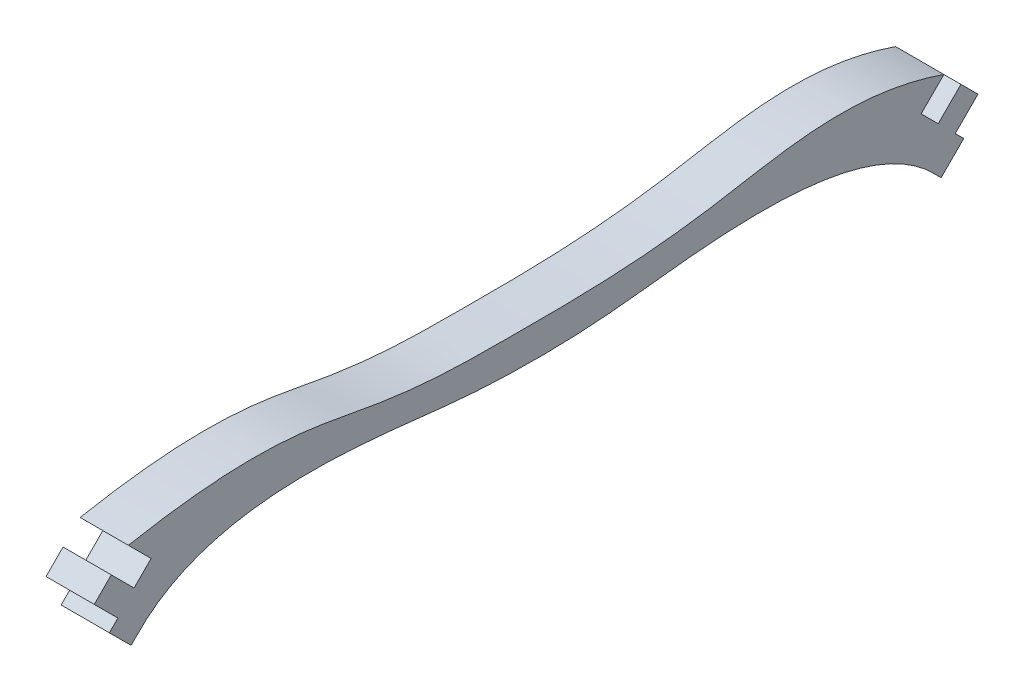
ISO-10303-21;
HEADER;
FILE_DESCRIPTION(('STEP AP214'),'2;1');
FILE_NAME('part.step','',(''),(''),'','','');
FILE_SCHEMA(('AUTOMOTIVE_DESIGN { 1 0 10303 214 1 1 1 1 }'));
ENDSEC;
DATA;
#1=APPLICATION_CONTEXT('core data for automotive mechanical design processes');
#2=APPLICATION_PROTOCOL_DEFINITION('international standard','automotive_design',2000,#1);
#3=PRODUCT_CONTEXT('',#1,'mechanical');
#4=PRODUCT('Part','Part','',(#3));
#5=PRODUCT_RELATED_PRODUCT_CATEGORY('part','',(#4));
#6=PRODUCT_DEFINITION_FORMATION('','',#4);
#7=PRODUCT_DEFINITION_CONTEXT('part definition',#1,'design');
#8=PRODUCT_DEFINITION('design','',#6,#7);
#9=PRODUCT_DEFINITION_SHAPE('','',#8);
#10=(LENGTH_UNIT() NAMED_UNIT(*) SI_UNIT(.MILLI.,.METRE.));
#11=(NAMED_UNIT(*) PLANE_ANGLE_UNIT() SI_UNIT($,.RADIAN.));
#12=(NAMED_UNIT(*) SI_UNIT($,.STERADIAN.) SOLID_ANGLE_UNIT());
#13=UNCERTAINTY_MEASURE_WITH_UNIT(LENGTH_MEASURE(1.E-05),#10,'distance_accuracy_value','');
#14=(GEOMETRIC_REPRESENTATION_CONTEXT(3) GLOBAL_UNCERTAINTY_ASSIGNED_CONTEXT((#13)) GLOBAL_UNIT_ASSIGNED_CONTEXT((#10,
#11,#12)) REPRESENTATION_CONTEXT('',''));
#15=CARTESIAN_POINT('',(0.,0.,0.));
#16=DIRECTION('',(0.,0.,1.));
#17=DIRECTION('',(1.,0.,0.));
#18=AXIS2_PLACEMENT_3D('',#15,#16,#17);
#19=CARTESIAN_POINT('',(6.,-0.70710678118655,50.7071067811865));
#20=CARTESIAN_POINT('',(6.,2.27627188658258,34.9408916969506));
#21=CARTESIAN_POINT('',(6.,-2.00631739391686,17.5880951778399));
#22=CARTESIAN_POINT('',(6.,-1.9737140086132,8.15045285990762));
#23=CARTESIAN_POINT('',(6.,-2.02794504432124,-7.03974104073929));
#24=CARTESIAN_POINT('',(6.,-1.2143781169843,-22.7757338302769));
#25=CARTESIAN_POINT('',(6.,3.25387403329058,-39.3055310529928));
#26=CARTESIAN_POINT('',(6.,-0.707106781186569,-50.7071067811866));
#27=B_SPLINE_CURVE_WITH_KNOTS('',3,(#19,#20,#21,#22,#23,#24,#25,#26),.UNSPECIFIED.,.F.,.F.,(4,1,
1,1,1,4),(0.,0.188415067306707,0.445999154863595,0.506836248432345,0.735948909425449,1.),.UNSPECIFIED.);
#28=DIRECTION('',(-1.,0.,0.));
#29=VECTOR('',#28,1.);
#30=SURFACE_OF_LINEAR_EXTRUSION('',#27,#29);
#31=CARTESIAN_POINT('',(0.,-0.70710678118655,50.7071067811865));
#32=CARTESIAN_POINT('',(0.,2.27627188658258,34.9408916969506));
#33=CARTESIAN_POINT('',(0.,-2.00631739391686,17.5880951778399));
#34=CARTESIAN_POINT('',(0.,-1.9737140086132,8.15045285990762));
#35=CARTESIAN_POINT('',(0.,-2.02794504432124,-7.03974104073929));
#36=CARTESIAN_POINT('',(0.,-1.2143781169843,-22.7757338302769));
#37=CARTESIAN_POINT('',(0.,3.25387403329058,-39.3055310529928));
#38=CARTESIAN_POINT('',(0.,-0.707106781186569,-50.7071067811866));
#39=B_SPLINE_CURVE_WITH_KNOTS('',3,(#31,#32,#33,#34,#35,#36,#37,#38),.UNSPECIFIED.,.F.,.F.,(4,1,
1,1,1,4),(0.,0.188415067306707,0.445999154863595,0.506836248432345,0.735948909425449,1.),.UNSPECIFIED.);
#40=CARTESIAN_POINT('',(0.,-0.707106781186542,50.7071067811865));
#41=VERTEX_POINT('',#40);
#42=CARTESIAN_POINT('',(0.,-0.707106781186757,-50.7071067811866));
#43=VERTEX_POINT('',#42);
#44=EDGE_CURVE('E190',#41,#43,#39,.T.);
#45=ORIENTED_EDGE('',*,*,#44,.F.);
#46=DIRECTION('',(-1.,0.,0.));
#47=VECTOR('',#46,1.);
#48=CARTESIAN_POINT('',(6.,-0.707106781186542,50.7071067811865));
#49=LINE('',#48,#47);
#50=CARTESIAN_POINT('',(6.,-0.707106781186542,50.7071067811865));
#51=VERTEX_POINT('',#50);
#52=EDGE_CURVE('E11',#51,#41,#49,.T.);
#53=ORIENTED_EDGE('',*,*,#52,.F.);
#54=CARTESIAN_POINT('',(6.,-0.707106781186757,-50.7071067811866));
#55=VERTEX_POINT('',#54);
#56=EDGE_CURVE('E246',#51,#55,#27,.T.);
#57=ORIENTED_EDGE('',*,*,#56,.T.);
#58=DIRECTION('',(-1.,0.,0.));
#59=VECTOR('',#58,1.);
#60=CARTESIAN_POINT('',(6.,-0.707106781186757,-50.7071067811866));
#61=LINE('',#60,#59);
#62=EDGE_CURVE('E53',#55,#43,#61,.T.);
#63=ORIENTED_EDGE('',*,*,#62,.T.);
#64=EDGE_LOOP('',(#45,#53,#57,#63));
#65=FACE_BOUND('',#64,.T.);
#66=ADVANCED_FACE('F36',(#65),#30,.T.);
#67=CARTESIAN_POINT('',(6.,-25.7071067811865,25.7071067811864));
#68=DIRECTION('',(0.,-0.707106781186549,0.707106781186546));
#69=DIRECTION('',(0.,-0.707106781186546,-0.707106781186549));
#70=AXIS2_PLACEMENT_3D('',#67,#68,#69);
#71=PLANE('',#70);
#72=DIRECTION('',(0.,0.707106781186546,0.707106781186549));
#73=VECTOR('',#72,1.);
#74=CARTESIAN_POINT('',(0.,-25.7071067811865,25.7071067811864));
#75=LINE('',#74,#73);
#76=CARTESIAN_POINT('',(0.,-3.53553390593271,47.8786796564404));
#77=VERTEX_POINT('',#76);
#78=EDGE_CURVE('E194',#77,#41,#75,.T.);
#79=ORIENTED_EDGE('',*,*,#78,.F.);
#80=DIRECTION('',(-1.,0.,0.));
#81=VECTOR('',#80,1.);
#82=CARTESIAN_POINT('',(6.,-3.53553390593271,47.8786796564404));
#83=LINE('',#82,#81);
#84=CARTESIAN_POINT('',(6.,-3.53553390593271,47.8786796564404));
#85=VERTEX_POINT('',#84);
#86=EDGE_CURVE('E45',#85,#77,#83,.T.);
#87=ORIENTED_EDGE('',*,*,#86,.F.);
#88=DIRECTION('',(0.,0.707106781186546,0.707106781186549));
#89=VECTOR('',#88,1.);
#90=CARTESIAN_POINT('',(6.,-25.7071067811865,25.7071067811864));
#91=LINE('',#90,#89);
#92=EDGE_CURVE('E300',#85,#51,#91,.T.);
#93=ORIENTED_EDGE('',*,*,#92,.T.);
#94=ORIENTED_EDGE('',*,*,#52,.T.);
#95=EDGE_LOOP('',(#79,#87,#93,#94));
#96=FACE_BOUND('',#95,.T.);
#97=ADVANCED_FACE('F287',(#96),#71,.T.);
#98=CARTESIAN_POINT('',(6.,22.1715728752538,22.1715728752539));
#99=DIRECTION('',(0.,0.707106781186546,0.707106781186549));
#100=DIRECTION('',(0.,-0.707106781186549,0.707106781186546));
#101=AXIS2_PLACEMENT_3D('',#98,#99,#100);
#102=PLANE('',#101);
#103=DIRECTION('',(0.,0.707106781186549,-0.707106781186546));
#104=VECTOR('',#103,1.);
#105=CARTESIAN_POINT('',(0.,22.1715728752538,22.1715728752539));
#106=LINE('',#105,#104);
#107=CARTESIAN_POINT('',(0.,-5.65685424949236,50.));
#108=VERTEX_POINT('',#107);
#109=EDGE_CURVE('E200',#108,#77,#106,.T.);
#110=ORIENTED_EDGE('',*,*,#109,.F.);
#111=DIRECTION('',(-1.,0.,0.));
#112=VECTOR('',#111,1.);
#113=CARTESIAN_POINT('',(6.,-5.65685424949236,50.));
#114=LINE('',#113,#112);
#115=CARTESIAN_POINT('',(6.,-5.65685424949236,50.));
#116=VERTEX_POINT('',#115);
#117=EDGE_CURVE('E276',#116,#108,#114,.T.);
#118=ORIENTED_EDGE('',*,*,#117,.F.);
#119=DIRECTION('',(0.,0.707106781186549,-0.707106781186546));
#120=VECTOR('',#119,1.);
#121=CARTESIAN_POINT('',(6.,22.1715728752538,22.1715728752539));
#122=LINE('',#121,#120);
#123=EDGE_CURVE('E283',#116,#85,#122,.T.);
#124=ORIENTED_EDGE('',*,*,#123,.T.);
#125=ORIENTED_EDGE('',*,*,#86,.T.);
#126=EDGE_LOOP('',(#110,#118,#124,#125));
#127=FACE_BOUND('',#126,.T.);
#128=ADVANCED_FACE('F281',(#127),#102,.T.);
#129=CARTESIAN_POINT('',(6.,-27.8284271247462,27.828427124746));
#130=DIRECTION('',(0.,0.707106781186549,-0.707106781186545));
#131=DIRECTION('',(0.,0.707106781186546,0.70710678118655));
#132=AXIS2_PLACEMENT_3D('',#129,#130,#131);
#133=PLANE('',#132);
#134=DIRECTION('',(0.,-0.707106781186546,-0.70710678118655));
#135=VECTOR('',#134,1.);
#136=CARTESIAN_POINT('',(0.,-27.8284271247462,27.828427124746));
#137=LINE('',#136,#135);
#138=CARTESIAN_POINT('',(0.,-2.82842712474618,52.8284271247462));
#139=VERTEX_POINT('',#138);
#140=EDGE_CURVE('E203',#139,#108,#137,.T.);
#141=ORIENTED_EDGE('',*,*,#140,.F.);
#142=DIRECTION('',(-1.,0.,0.));
#143=VECTOR('',#142,1.);
#144=CARTESIAN_POINT('',(6.,-2.82842712474618,52.8284271247462));
#145=LINE('',#144,#143);
#146=CARTESIAN_POINT('',(6.,-2.82842712474618,52.8284271247462));
#147=VERTEX_POINT('',#146);
#148=EDGE_CURVE('E274',#147,#139,#145,.T.);
#149=ORIENTED_EDGE('',*,*,#148,.F.);
#150=DIRECTION('',(0.,-0.707106781186546,-0.70710678118655));
#151=VECTOR('',#150,1.);
#152=CARTESIAN_POINT('',(6.,-27.8284271247462,27.828427124746));
#153=LINE('',#152,#151);
#154=EDGE_CURVE('E297',#147,#116,#153,.T.);
#155=ORIENTED_EDGE('',*,*,#154,.T.);
#156=ORIENTED_EDGE('',*,*,#117,.T.);
#157=EDGE_LOOP('',(#141,#149,#155,#156));
#158=FACE_BOUND('',#157,.T.);
#159=ADVANCED_FACE('F294',(#158),#133,.T.);
#160=CARTESIAN_POINT('',(6.,25.,25.0000000000002));
#161=DIRECTION('',(0.,0.707106781186545,0.70710678118655));
#162=DIRECTION('',(0.,-0.70710678118655,0.707106781186545));
#163=AXIS2_PLACEMENT_3D('',#160,#161,#162);
#164=PLANE('',#163);
#165=DIRECTION('',(0.,0.70710678118655,-0.707106781186545));
#166=VECTOR('',#165,1.);
#167=CARTESIAN_POINT('',(0.,25.,25.0000000000002));
#168=LINE('',#167,#166);
#169=CARTESIAN_POINT('',(0.,-4.94974746830583,54.9497474683058));
#170=VERTEX_POINT('',#169);
#171=EDGE_CURVE('E206',#170,#139,#168,.T.);
#172=ORIENTED_EDGE('',*,*,#171,.F.);
#173=DIRECTION('',(-1.,0.,0.));
#174=VECTOR('',#173,1.);
#175=CARTESIAN_POINT('',(6.,-4.94974746830583,54.9497474683058));
#176=LINE('',#175,#174);
#177=CARTESIAN_POINT('',(6.,-4.94974746830583,54.9497474683058));
#178=VERTEX_POINT('',#177);
#179=EDGE_CURVE('E272',#178,#170,#176,.T.);
#180=ORIENTED_EDGE('',*,*,#179,.F.);
#181=DIRECTION('',(0.,0.70710678118655,-0.707106781186545));
#182=VECTOR('',#181,1.);
#183=CARTESIAN_POINT('',(6.,25.,25.0000000000002));
#184=LINE('',#183,#182);
#185=EDGE_CURVE('E302',#178,#147,#184,.T.);
#186=ORIENTED_EDGE('',*,*,#185,.T.);
#187=ORIENTED_EDGE('',*,*,#148,.T.);
#188=EDGE_LOOP('',(#172,#180,#186,#187));
#189=FACE_BOUND('',#188,.T.);
#190=ADVANCED_FACE('F348',(#189),#164,.T.);
#191=CARTESIAN_POINT('',(6.,-29.9497474683058,29.9497474683057));
#192=DIRECTION('',(0.,0.707106781186549,-0.707106781186546));
#193=DIRECTION('',(0.,0.707106781186546,0.707106781186549));
#194=AXIS2_PLACEMENT_3D('',#191,#192,#193);
#195=PLANE('',#194);
#196=DIRECTION('',(0.,-0.707106781186546,-0.707106781186549));
#197=VECTOR('',#196,1.);
#198=CARTESIAN_POINT('',(0.,-29.9497474683058,29.9497474683057));
#199=LINE('',#198,#197);
#200=CARTESIAN_POINT('',(0.,-7.89169376846926,52.0078011681424));
#201=VERTEX_POINT('',#200);
#202=EDGE_CURVE('E209',#170,#201,#199,.T.);
#203=ORIENTED_EDGE('',*,*,#202,.T.);
#204=DIRECTION('',(-1.,0.,0.));
#205=VECTOR('',#204,1.);
#206=CARTESIAN_POINT('',(6.,-7.89169376846926,52.0078011681424));
#207=LINE('',#206,#205);
#208=CARTESIAN_POINT('',(6.,-7.89169376846926,52.0078011681424));
#209=VERTEX_POINT('',#208);
#210=EDGE_CURVE('E269',#209,#201,#207,.T.);
#211=ORIENTED_EDGE('',*,*,#210,.F.);
#212=DIRECTION('',(0.,-0.707106781186546,-0.707106781186549));
#213=VECTOR('',#212,1.);
#214=CARTESIAN_POINT('',(6.,-29.9497474683058,29.9497474683057));
#215=LINE('',#214,#213);
#216=EDGE_CURVE('E307',#178,#209,#215,.T.);
#217=ORIENTED_EDGE('',*,*,#216,.F.);
#218=ORIENTED_EDGE('',*,*,#179,.T.);
#219=EDGE_LOOP('',(#203,#211,#217,#218));
#220=FACE_BOUND('',#219,.T.);
#221=ADVANCED_FACE('F344',(#220),#195,.F.);
#222=CARTESIAN_POINT('',(6.,22.0580536998368,22.0580536998382));
#223=DIRECTION('',(0.,-0.707106781186525,-0.70710678118657));
#224=DIRECTION('',(0.,0.70710678118657,-0.707106781186525));
#225=AXIS2_PLACEMENT_3D('',#222,#223,#224);
#226=PLANE('',#225);
#227=DIRECTION('',(0.,-0.70710678118657,0.707106781186525));
#228=VECTOR('',#227,1.);
#229=CARTESIAN_POINT('',(0.,22.0580536998368,22.0580536998382));
#230=LINE('',#229,#228);
#231=CARTESIAN_POINT('',(0.,-8.95235394024911,53.0684613399222));
#232=VERTEX_POINT('',#231);
#233=EDGE_CURVE('E211',#201,#232,#230,.T.);
#234=ORIENTED_EDGE('',*,*,#233,.T.);
#235=DIRECTION('',(-1.,0.,0.));
#236=VECTOR('',#235,1.);
#237=CARTESIAN_POINT('',(6.,-8.95235394024911,53.0684613399222));
#238=LINE('',#237,#236);
#239=CARTESIAN_POINT('',(6.,-8.95235394024911,53.0684613399222));
#240=VERTEX_POINT('',#239);
#241=EDGE_CURVE('E266',#240,#232,#238,.T.);
#242=ORIENTED_EDGE('',*,*,#241,.F.);
#243=DIRECTION('',(0.,-0.70710678118657,0.707106781186525));
#244=VECTOR('',#243,1.);
#245=CARTESIAN_POINT('',(6.,22.0580536998368,22.0580536998382));
#246=LINE('',#245,#244);
#247=EDGE_CURVE('E309',#209,#240,#246,.T.);
#248=ORIENTED_EDGE('',*,*,#247,.F.);
#249=ORIENTED_EDGE('',*,*,#210,.T.);
#250=EDGE_LOOP('',(#234,#242,#248,#249));
#251=FACE_BOUND('',#250,.T.);
#252=ADVANCED_FACE('F340',(#251),#226,.F.);
#253=CARTESIAN_POINT('',(6.,-31.0104076400857,31.0104076400855));
#254=DIRECTION('',(0.,0.70710678118655,-0.707106781186545));
#255=DIRECTION('',(0.,0.707106781186545,0.70710678118655));
#256=AXIS2_PLACEMENT_3D('',#253,#254,#255);
#257=PLANE('',#256);
#258=DIRECTION('',(0.,-0.707106781186545,-0.70710678118655));
#259=VECTOR('',#258,1.);
#260=CARTESIAN_POINT('',(0.,-31.0104076400857,31.0104076400855));
#261=LINE('',#260,#259);
#262=CARTESIAN_POINT('',(0.,-11.6562025354037,50.3646127447675));
#263=VERTEX_POINT('',#262);
#264=EDGE_CURVE('E213',#232,#263,#261,.T.);
#265=ORIENTED_EDGE('',*,*,#264,.T.);
#266=DIRECTION('',(-1.,0.,0.));
#267=VECTOR('',#266,1.);
#268=CARTESIAN_POINT('',(6.,-11.6562025354037,50.3646127447675));
#269=LINE('',#268,#267);
#270=CARTESIAN_POINT('',(6.,-11.6562025354037,50.3646127447675));
#271=VERTEX_POINT('',#270);
#272=EDGE_CURVE('E263',#271,#263,#269,.T.);
#273=ORIENTED_EDGE('',*,*,#272,.F.);
#274=DIRECTION('',(0.,-0.707106781186545,-0.70710678118655));
#275=VECTOR('',#274,1.);
#276=CARTESIAN_POINT('',(6.,-31.0104076400857,31.0104076400855));
#277=LINE('',#276,#275);
#278=EDGE_CURVE('E311',#240,#271,#277,.T.);
#279=ORIENTED_EDGE('',*,*,#278,.F.);
#280=ORIENTED_EDGE('',*,*,#241,.T.);
#281=EDGE_LOOP('',(#265,#273,#279,#280));
#282=FACE_BOUND('',#281,.T.);
#283=ADVANCED_FACE('F336',(#282),#257,.F.);
#284=CARTESIAN_POINT('',(6.,19.354205104682,19.3542051046823));
#285=DIRECTION('',(0.,0.707106781186542,0.707106781186553));
#286=DIRECTION('',(0.,-0.707106781186553,0.707106781186542));
#287=AXIS2_PLACEMENT_3D('',#284,#285,#286);
#288=PLANE('',#287);
#289=DIRECTION('',(0.,0.707106781186553,-0.707106781186542));
#290=VECTOR('',#289,1.);
#291=CARTESIAN_POINT('',(0.,19.354205104682,19.3542051046823));
#292=LINE('',#291,#290);
#293=CARTESIAN_POINT('',(0.,-10.9490957542172,49.657505963581));
#294=VERTEX_POINT('',#293);
#295=EDGE_CURVE('E215',#263,#294,#292,.T.);
#296=ORIENTED_EDGE('',*,*,#295,.T.);
#297=DIRECTION('',(-1.,0.,0.));
#298=VECTOR('',#297,1.);
#299=CARTESIAN_POINT('',(6.,-10.9490957542172,49.657505963581));
#300=LINE('',#299,#298);
#301=CARTESIAN_POINT('',(6.,-10.9490957542172,49.657505963581));
#302=VERTEX_POINT('',#301);
#303=EDGE_CURVE('E260',#302,#294,#300,.T.);
#304=ORIENTED_EDGE('',*,*,#303,.F.);
#305=DIRECTION('',(0.,0.707106781186553,-0.707106781186542));
#306=VECTOR('',#305,1.);
#307=CARTESIAN_POINT('',(6.,19.354205104682,19.3542051046823));
#308=LINE('',#307,#306);
#309=EDGE_CURVE('E313',#271,#302,#308,.T.);
#310=ORIENTED_EDGE('',*,*,#309,.F.);
#311=ORIENTED_EDGE('',*,*,#272,.T.);
#312=EDGE_LOOP('',(#296,#304,#310,#311));
#313=FACE_BOUND('',#312,.T.);
#314=ADVANCED_FACE('F331',(#313),#288,.F.);
#315=CARTESIAN_POINT('',(6.,-10.9490957542172,49.657505963581));
#316=CARTESIAN_POINT('',(6.,-3.21388418856061,42.2978755452239));
#317=CARTESIAN_POINT('',(6.,-3.85048478093911,21.5916734687484));
#318=CARTESIAN_POINT('',(6.,-6.00817980719354,7.81090534966644));
#319=CARTESIAN_POINT('',(6.,-6.00817980719361,-7.81090534966644));
#320=CARTESIAN_POINT('',(6.,-3.85048478093903,-21.5916734687484));
#321=CARTESIAN_POINT('',(6.,-3.21388418856072,-42.297875545224));
#322=CARTESIAN_POINT('',(6.,-10.9490957542172,-49.657505963581));
#323=B_SPLINE_CURVE_WITH_KNOTS('',3,(#315,#316,#317,#318,#319,#320,#321,#322),.UNSPECIFIED.,.F.,
.F.,(4,1,1,1,1,4),(0.,0.322683239192115,0.480298137688013,0.519701862311987,0.677316760807884,
1.),.UNSPECIFIED.);
#324=DIRECTION('',(-1.,0.,0.));
#325=VECTOR('',#324,1.);
#326=SURFACE_OF_LINEAR_EXTRUSION('',#323,#325);
#327=CARTESIAN_POINT('',(0.,-10.9490957542172,49.657505963581));
#328=CARTESIAN_POINT('',(0.,-3.21388418856061,42.2978755452239));
#329=CARTESIAN_POINT('',(0.,-3.85048478093911,21.5916734687484));
#330=CARTESIAN_POINT('',(0.,-6.00817980719354,7.81090534966644));
#331=CARTESIAN_POINT('',(0.,-6.00817980719361,-7.81090534966644));
#332=CARTESIAN_POINT('',(0.,-3.85048478093903,-21.5916734687484));
#333=CARTESIAN_POINT('',(0.,-3.21388418856072,-42.297875545224));
#334=CARTESIAN_POINT('',(0.,-10.9490957542172,-49.657505963581));
#335=B_SPLINE_CURVE_WITH_KNOTS('',3,(#327,#328,#329,#330,#331,#332,#333,#334),.UNSPECIFIED.,.F.,
.F.,(4,1,1,1,1,4),(0.,0.322683239192115,0.480298137688013,0.519701862311987,0.677316760807884,
1.),.UNSPECIFIED.);
#336=CARTESIAN_POINT('',(0.,-10.9490957542172,-49.657505963581));
#337=VERTEX_POINT('',#336);
#338=EDGE_CURVE('E217',#294,#337,#335,.T.);
#339=ORIENTED_EDGE('',*,*,#338,.T.);
#340=DIRECTION('',(-1.,0.,0.));
#341=VECTOR('',#340,1.);
#342=CARTESIAN_POINT('',(6.,-10.9490957542172,-49.657505963581));
#343=LINE('',#342,#341);
#344=CARTESIAN_POINT('',(6.,-10.9490957542172,-49.657505963581));
#345=VERTEX_POINT('',#344);
#346=EDGE_CURVE('E258',#345,#337,#343,.T.);
#347=ORIENTED_EDGE('',*,*,#346,.F.);
#348=EDGE_CURVE('E315',#302,#345,#323,.T.);
#349=ORIENTED_EDGE('',*,*,#348,.F.);
#350=ORIENTED_EDGE('',*,*,#303,.T.);
#351=EDGE_LOOP('',(#339,#347,#349,#350));
#352=FACE_BOUND('',#351,.T.);
#353=ADVANCED_FACE('F326',(#352),#326,.F.);
#354=CARTESIAN_POINT('',(6.,19.3542051046819,-19.354205104682));
#355=DIRECTION('',(0.,-0.707106781186546,0.707106781186549));
#356=DIRECTION('',(0.,-0.707106781186549,-0.707106781186546));
#357=AXIS2_PLACEMENT_3D('',#354,#355,#356);
#358=PLANE('',#357);
#359=DIRECTION('',(0.,0.707106781186549,0.707106781186546));
#360=VECTOR('',#359,1.);
#361=CARTESIAN_POINT('',(0.,19.3542051046819,-19.354205104682));
#362=LINE('',#361,#360);
#363=CARTESIAN_POINT('',(0.,-11.6562025354038,-50.3646127447675));
#364=VERTEX_POINT('',#363);
#365=EDGE_CURVE('E222',#364,#337,#362,.T.);
#366=ORIENTED_EDGE('',*,*,#365,.F.);
#367=DIRECTION('',(-1.,0.,0.));
#368=VECTOR('',#367,1.);
#369=CARTESIAN_POINT('',(6.,-11.6562025354038,-50.3646127447675));
#370=LINE('',#369,#368);
#371=CARTESIAN_POINT('',(6.,-11.6562025354038,-50.3646127447675));
#372=VERTEX_POINT('',#371);
#373=EDGE_CURVE('E256',#372,#364,#370,.T.);
#374=ORIENTED_EDGE('',*,*,#373,.F.);
#375=DIRECTION('',(0.,0.707106781186549,0.707106781186546));
#376=VECTOR('',#375,1.);
#377=CARTESIAN_POINT('',(6.,19.3542051046819,-19.354205104682));
#378=LINE('',#377,#376);
#379=EDGE_CURVE('E320',#372,#345,#378,.T.);
#380=ORIENTED_EDGE('',*,*,#379,.T.);
#381=ORIENTED_EDGE('',*,*,#346,.T.);
#382=EDGE_LOOP('',(#366,#374,#380,#381));
#383=FACE_BOUND('',#382,.T.);
#384=ADVANCED_FACE('F330',(#383),#358,.T.);
#385=CARTESIAN_POINT('',(6.,-31.0104076400856,-31.0104076400857));
#386=DIRECTION('',(0.,-0.707106781186546,-0.707106781186548));
#387=DIRECTION('',(0.,0.707106781186549,-0.707106781186546));
#388=AXIS2_PLACEMENT_3D('',#385,#386,#387);
#389=PLANE('',#388);
#390=DIRECTION('',(0.,-0.707106781186549,0.707106781186546));
#391=VECTOR('',#390,1.);
#392=CARTESIAN_POINT('',(0.,-31.0104076400856,-31.0104076400857));
#393=LINE('',#392,#391);
#394=CARTESIAN_POINT('',(0.,-8.83883476483223,-53.1819805153391));
#395=VERTEX_POINT('',#394);
#396=EDGE_CURVE('E228',#395,#364,#393,.T.);
#397=ORIENTED_EDGE('',*,*,#396,.F.);
#398=DIRECTION('',(-1.,0.,0.));
#399=VECTOR('',#398,1.);
#400=CARTESIAN_POINT('',(6.,-8.83883476483223,-53.1819805153391));
#401=LINE('',#400,#399);
#402=CARTESIAN_POINT('',(6.,-8.83883476483223,-53.1819805153391));
#403=VERTEX_POINT('',#402);
#404=EDGE_CURVE('E254',#403,#395,#401,.T.);
#405=ORIENTED_EDGE('',*,*,#404,.F.);
#406=DIRECTION('',(0.,-0.707106781186549,0.707106781186546));
#407=VECTOR('',#406,1.);
#408=CARTESIAN_POINT('',(6.,-31.0104076400856,-31.0104076400857));
#409=LINE('',#408,#407);
#410=EDGE_CURVE('E404',#403,#372,#409,.T.);
#411=ORIENTED_EDGE('',*,*,#410,.T.);
#412=ORIENTED_EDGE('',*,*,#373,.T.);
#413=EDGE_LOOP('',(#397,#405,#411,#412));
#414=FACE_BOUND('',#413,.T.);
#415=ADVANCED_FACE('F385',(#414),#389,.T.);
#416=CARTESIAN_POINT('',(6.,22.1715728752535,-22.1715728752539));
#417=DIRECTION('',(0.,0.707106781186541,-0.707106781186554));
#418=DIRECTION('',(0.,0.707106781186554,0.707106781186541));
#419=AXIS2_PLACEMENT_3D('',#416,#417,#418);
#420=PLANE('',#419);
#421=DIRECTION('',(0.,-0.707106781186554,-0.707106781186541));
#422=VECTOR('',#421,1.);
#423=CARTESIAN_POINT('',(0.,22.1715728752535,-22.1715728752539));
#424=LINE('',#423,#422);
#425=CARTESIAN_POINT('',(0.,-7.77817459305251,-52.1213203435594));
#426=VERTEX_POINT('',#425);
#427=EDGE_CURVE('E231',#426,#395,#424,.T.);
#428=ORIENTED_EDGE('',*,*,#427,.F.);
#429=DIRECTION('',(-1.,0.,0.));
#430=VECTOR('',#429,1.);
#431=CARTESIAN_POINT('',(6.,-7.77817459305251,-52.1213203435594));
#432=LINE('',#431,#430);
#433=CARTESIAN_POINT('',(6.,-7.77817459305251,-52.1213203435594));
#434=VERTEX_POINT('',#433);
#435=EDGE_CURVE('E252',#434,#426,#432,.T.);
#436=ORIENTED_EDGE('',*,*,#435,.F.);
#437=DIRECTION('',(0.,-0.707106781186554,-0.707106781186541));
#438=VECTOR('',#437,1.);
#439=CARTESIAN_POINT('',(6.,22.1715728752535,-22.1715728752539));
#440=LINE('',#439,#438);
#441=EDGE_CURVE('E401',#434,#403,#440,.T.);
#442=ORIENTED_EDGE('',*,*,#441,.T.);
#443=ORIENTED_EDGE('',*,*,#404,.T.);
#444=EDGE_LOOP('',(#428,#436,#442,#443));
#445=FACE_BOUND('',#444,.T.);
#446=ADVANCED_FACE('F382',(#445),#420,.T.);
#447=CARTESIAN_POINT('',(6.,-29.949747468306,-29.9497474683058));
#448=DIRECTION('',(0.,-0.707106781186549,-0.707106781186546));
#449=DIRECTION('',(0.,0.707106781186546,-0.707106781186549));
#450=AXIS2_PLACEMENT_3D('',#447,#448,#449);
#451=PLANE('',#450);
#452=DIRECTION('',(0.,-0.707106781186546,0.707106781186549));
#453=VECTOR('',#452,1.);
#454=CARTESIAN_POINT('',(0.,-29.949747468306,-29.9497474683058));
#455=LINE('',#454,#453);
#456=CARTESIAN_POINT('',(0.,-4.9497474683063,-54.9497474683056));
#457=VERTEX_POINT('',#456);
#458=EDGE_CURVE('E234',#457,#426,#455,.T.);
#459=ORIENTED_EDGE('',*,*,#458,.F.);
#460=DIRECTION('',(-1.,0.,0.));
#461=VECTOR('',#460,1.);
#462=CARTESIAN_POINT('',(6.,-4.9497474683063,-54.9497474683056));
#463=LINE('',#462,#461);
#464=CARTESIAN_POINT('',(6.,-4.9497474683063,-54.9497474683056));
#465=VERTEX_POINT('',#464);
#466=EDGE_CURVE('E250',#465,#457,#463,.T.);
#467=ORIENTED_EDGE('',*,*,#466,.F.);
#468=DIRECTION('',(0.,-0.707106781186546,0.707106781186549));
#469=VECTOR('',#468,1.);
#470=CARTESIAN_POINT('',(6.,-29.949747468306,-29.9497474683058));
#471=LINE('',#470,#469);
#472=EDGE_CURVE('E403',#465,#434,#471,.T.);
#473=ORIENTED_EDGE('',*,*,#472,.T.);
#474=ORIENTED_EDGE('',*,*,#435,.T.);
#475=EDGE_LOOP('',(#459,#467,#473,#474));
#476=FACE_BOUND('',#475,.T.);
#477=ADVANCED_FACE('F378',(#476),#451,.T.);
#478=CARTESIAN_POINT('',(6.,24.9999999999997,-25.));
#479=DIRECTION('',(0.,0.707106781186543,-0.707106781186552));
#480=DIRECTION('',(0.,0.707106781186552,0.707106781186543));
#481=AXIS2_PLACEMENT_3D('',#478,#479,#480);
#482=PLANE('',#481);
#483=DIRECTION('',(0.,-0.707106781186552,-0.707106781186543));
#484=VECTOR('',#483,1.);
#485=CARTESIAN_POINT('',(0.,24.9999999999997,-25.));
#486=LINE('',#485,#484);
#487=CARTESIAN_POINT('',(0.,-2.82842712474665,-52.828427124746));
#488=VERTEX_POINT('',#487);
#489=EDGE_CURVE('E237',#488,#457,#486,.T.);
#490=ORIENTED_EDGE('',*,*,#489,.F.);
#491=DIRECTION('',(-1.,0.,0.));
#492=VECTOR('',#491,1.);
#493=CARTESIAN_POINT('',(6.,-2.82842712474665,-52.828427124746));
#494=LINE('',#493,#492);
#495=CARTESIAN_POINT('',(6.,-2.82842712474665,-52.828427124746));
#496=VERTEX_POINT('',#495);
#497=EDGE_CURVE('E172',#496,#488,#494,.T.);
#498=ORIENTED_EDGE('',*,*,#497,.F.);
#499=DIRECTION('',(0.,-0.707106781186552,-0.707106781186543));
#500=VECTOR('',#499,1.);
#501=CARTESIAN_POINT('',(6.,24.9999999999997,-25.));
#502=LINE('',#501,#500);
#503=EDGE_CURVE('E182',#496,#465,#502,.T.);
#504=ORIENTED_EDGE('',*,*,#503,.T.);
#505=ORIENTED_EDGE('',*,*,#466,.T.);
#506=EDGE_LOOP('',(#490,#498,#504,#505));
#507=FACE_BOUND('',#506,.T.);
#508=ADVANCED_FACE('F375',(#507),#482,.T.);
#509=CARTESIAN_POINT('',(6.,-27.8284271247463,-27.8284271247461));
#510=DIRECTION('',(0.,0.70710678118655,0.707106781186544));
#511=DIRECTION('',(0.,-0.707106781186545,0.70710678118655));
#512=AXIS2_PLACEMENT_3D('',#509,#510,#511);
#513=PLANE('',#512);
#514=DIRECTION('',(0.,0.707106781186545,-0.70710678118655));
#515=VECTOR('',#514,1.);
#516=CARTESIAN_POINT('',(0.,-27.8284271247463,-27.8284271247461));
#517=LINE('',#516,#515);
#518=CARTESIAN_POINT('',(0.,-5.65685424949281,-49.9999999999998));
#519=VERTEX_POINT('',#518);
#520=EDGE_CURVE('E168',#519,#488,#517,.T.);
#521=ORIENTED_EDGE('',*,*,#520,.F.);
#522=DIRECTION('',(-1.,0.,0.));
#523=VECTOR('',#522,1.);
#524=CARTESIAN_POINT('',(6.,-5.65685424949281,-49.9999999999998));
#525=LINE('',#524,#523);
#526=CARTESIAN_POINT('',(6.,-5.65685424949281,-49.9999999999998));
#527=VERTEX_POINT('',#526);
#528=EDGE_CURVE('E163',#527,#519,#525,.T.);
#529=ORIENTED_EDGE('',*,*,#528,.F.);
#530=DIRECTION('',(0.,0.707106781186545,-0.70710678118655));
#531=VECTOR('',#530,1.);
#532=CARTESIAN_POINT('',(6.,-27.8284271247463,-27.8284271247461));
#533=LINE('',#532,#531);
#534=EDGE_CURVE('E166',#527,#496,#533,.T.);
#535=ORIENTED_EDGE('',*,*,#534,.T.);
#536=ORIENTED_EDGE('',*,*,#497,.T.);
#537=EDGE_LOOP('',(#521,#529,#535,#536));
#538=FACE_BOUND('',#537,.T.);
#539=ADVANCED_FACE('F165',(#538),#513,.T.);
#540=CARTESIAN_POINT('',(6.,22.1715728752535,-22.1715728752537));
#541=DIRECTION('',(0.,0.707106781186545,-0.70710678118655));
#542=DIRECTION('',(0.,0.70710678118655,0.707106781186545));
#543=AXIS2_PLACEMENT_3D('',#540,#541,#542);
#544=PLANE('',#543);
#545=DIRECTION('',(0.,-0.70710678118655,-0.707106781186545));
#546=VECTOR('',#545,1.);
#547=CARTESIAN_POINT('',(0.,22.1715728752535,-22.1715728752537));
#548=LINE('',#547,#546);
#549=CARTESIAN_POINT('',(0.,-3.53553390593317,-47.8786796564401));
#550=VERTEX_POINT('',#549);
#551=EDGE_CURVE('E241',#550,#519,#548,.T.);
#552=ORIENTED_EDGE('',*,*,#551,.F.);
#553=DIRECTION('',(-1.,0.,0.));
#554=VECTOR('',#553,1.);
#555=CARTESIAN_POINT('',(6.,-3.53553390593317,-47.8786796564401));
#556=LINE('',#555,#554);
#557=CARTESIAN_POINT('',(6.,-3.53553390593317,-47.8786796564401));
#558=VERTEX_POINT('',#557);
#559=EDGE_CURVE('E108',#558,#550,#556,.T.);
#560=ORIENTED_EDGE('',*,*,#559,.F.);
#561=DIRECTION('',(0.,-0.70710678118655,-0.707106781186545));
#562=VECTOR('',#561,1.);
#563=CARTESIAN_POINT('',(6.,22.1715728752535,-22.1715728752537));
#564=LINE('',#563,#562);
#565=EDGE_CURVE('E179',#558,#527,#564,.T.);
#566=ORIENTED_EDGE('',*,*,#565,.T.);
#567=ORIENTED_EDGE('',*,*,#528,.T.);
#568=EDGE_LOOP('',(#552,#560,#566,#567));
#569=FACE_BOUND('',#568,.T.);
#570=ADVANCED_FACE('F184',(#569),#544,.T.);
#571=CARTESIAN_POINT('',(6.,-25.7071067811867,-25.7071067811865));
#572=DIRECTION('',(0.,-0.70710678118655,-0.707106781186545));
#573=DIRECTION('',(0.,0.707106781186545,-0.70710678118655));
#574=AXIS2_PLACEMENT_3D('',#571,#572,#573);
#575=PLANE('',#574);
#576=DIRECTION('',(0.,-0.707106781186545,0.70710678118655));
#577=VECTOR('',#576,1.);
#578=CARTESIAN_POINT('',(0.,-25.7071067811867,-25.7071067811865));
#579=LINE('',#578,#577);
#580=EDGE_CURVE('E243',#43,#550,#579,.T.);
#581=ORIENTED_EDGE('',*,*,#580,.F.);
#582=ORIENTED_EDGE('',*,*,#62,.F.);
#583=DIRECTION('',(0.,-0.707106781186545,0.70710678118655));
#584=VECTOR('',#583,1.);
#585=CARTESIAN_POINT('',(6.,-25.7071067811867,-25.7071067811865));
#586=LINE('',#585,#584);
#587=EDGE_CURVE('E185',#55,#558,#586,.T.);
#588=ORIENTED_EDGE('',*,*,#587,.T.);
#589=ORIENTED_EDGE('',*,*,#559,.T.);
#590=EDGE_LOOP('',(#581,#582,#588,#589));
#591=FACE_BOUND('',#590,.T.);
#592=ADVANCED_FACE('F362',(#591),#575,.T.);
#593=CARTESIAN_POINT('',(6.,0.,0.));
#594=DIRECTION('',(1.,0.,0.));
#595=DIRECTION('',(0.,0.,-1.));
#596=AXIS2_PLACEMENT_3D('',#593,#594,#595);
#597=PLANE('',#596);
#598=ORIENTED_EDGE('',*,*,#56,.F.);
#599=ORIENTED_EDGE('',*,*,#92,.F.);
#600=ORIENTED_EDGE('',*,*,#123,.F.);
#601=ORIENTED_EDGE('',*,*,#154,.F.);
#602=ORIENTED_EDGE('',*,*,#185,.F.);
#603=ORIENTED_EDGE('',*,*,#216,.T.);
#604=ORIENTED_EDGE('',*,*,#247,.T.);
#605=ORIENTED_EDGE('',*,*,#278,.T.);
#606=ORIENTED_EDGE('',*,*,#309,.T.);
#607=ORIENTED_EDGE('',*,*,#348,.T.);
#608=ORIENTED_EDGE('',*,*,#379,.F.);
#609=ORIENTED_EDGE('',*,*,#410,.F.);
#610=ORIENTED_EDGE('',*,*,#441,.F.);
#611=ORIENTED_EDGE('',*,*,#472,.F.);
#612=ORIENTED_EDGE('',*,*,#503,.F.);
#613=ORIENTED_EDGE('',*,*,#534,.F.);
#614=ORIENTED_EDGE('',*,*,#565,.F.);
#615=ORIENTED_EDGE('',*,*,#587,.F.);
#616=EDGE_LOOP('',(#598,#599,#600,#601,#602,#603,#604,#605,#606,#607,#608,#609,#610,#611,#612,
#613,#614,#615));
#617=FACE_BOUND('',#616,.T.);
#618=ADVANCED_FACE('F177',(#617),#597,.T.);
#619=CARTESIAN_POINT('',(0.,0.,0.));
#620=DIRECTION('',(1.,0.,0.));
#621=DIRECTION('',(0.,0.,-1.));
#622=AXIS2_PLACEMENT_3D('',#619,#620,#621);
#623=PLANE('',#622);
#624=ORIENTED_EDGE('',*,*,#44,.T.);
#625=ORIENTED_EDGE('',*,*,#580,.T.);
#626=ORIENTED_EDGE('',*,*,#551,.T.);
#627=ORIENTED_EDGE('',*,*,#520,.T.);
#628=ORIENTED_EDGE('',*,*,#489,.T.);
#629=ORIENTED_EDGE('',*,*,#458,.T.);
#630=ORIENTED_EDGE('',*,*,#427,.T.);
#631=ORIENTED_EDGE('',*,*,#396,.T.);
#632=ORIENTED_EDGE('',*,*,#365,.T.);
#633=ORIENTED_EDGE('',*,*,#338,.F.);
#634=ORIENTED_EDGE('',*,*,#295,.F.);
#635=ORIENTED_EDGE('',*,*,#264,.F.);
#636=ORIENTED_EDGE('',*,*,#233,.F.);
#637=ORIENTED_EDGE('',*,*,#202,.F.);
#638=ORIENTED_EDGE('',*,*,#171,.T.);
#639=ORIENTED_EDGE('',*,*,#140,.T.);
#640=ORIENTED_EDGE('',*,*,#109,.T.);
#641=ORIENTED_EDGE('',*,*,#78,.T.);
#642=EDGE_LOOP('',(#624,#625,#626,#627,#628,#629,#630,#631,#632,#633,#634,#635,#636,#637,#638,
#639,#640,#641));
#643=FACE_BOUND('',#642,.T.);
#644=ADVANCED_FACE('F289',(#643),#623,.F.);
#645=CLOSED_SHELL('',(#66,#97,#128,#159,#190,#221,#252,#283,#314,#353,#384,#415,#446,#477,#508,
#539,#570,#592,#618,#644));
#646=MANIFOLD_SOLID_BREP('B2',#645);
#647=ADVANCED_BREP_SHAPE_REPRESENTATION('',(#18,#646),#14);
#648=SHAPE_DEFINITION_REPRESENTATION(#9,#647);
ENDSEC;
END-ISO-10303-21;
